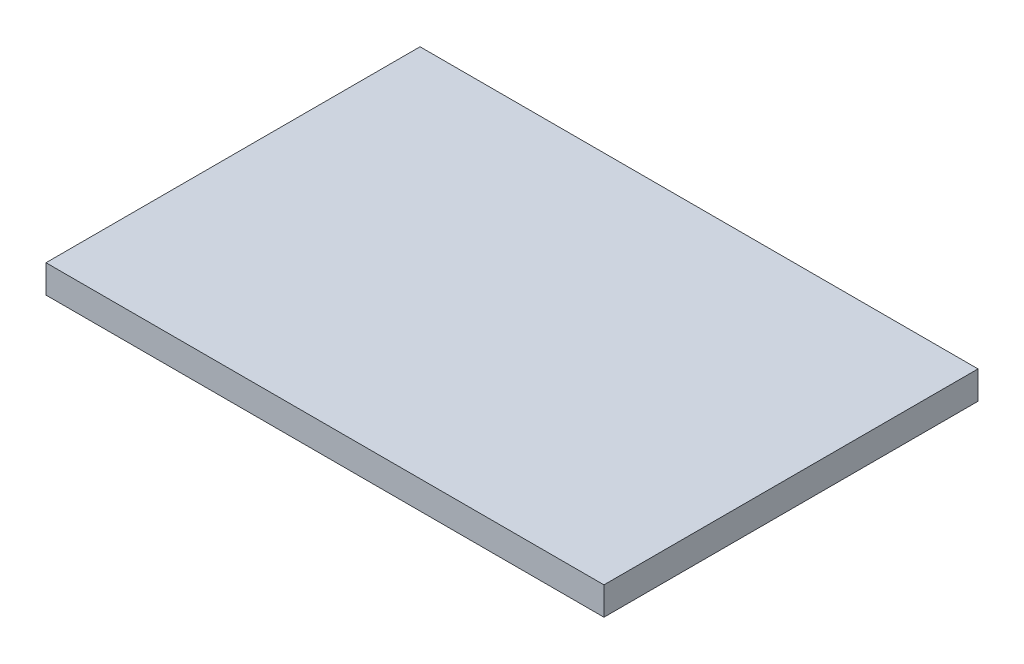
ISO-10303-21;
HEADER;
FILE_DESCRIPTION(('STEP AP214'),'2;1');
FILE_NAME('part.step','',(''),(''),'','','');
FILE_SCHEMA(('AUTOMOTIVE_DESIGN { 1 0 10303 214 1 1 1 1 }'));
ENDSEC;
DATA;
#1=APPLICATION_CONTEXT('core data for automotive mechanical design processes');
#2=APPLICATION_PROTOCOL_DEFINITION('international standard','automotive_design',2000,#1);
#3=PRODUCT_CONTEXT('',#1,'mechanical');
#4=PRODUCT('Part','Part','',(#3));
#5=PRODUCT_RELATED_PRODUCT_CATEGORY('part','',(#4));
#6=PRODUCT_DEFINITION_FORMATION('','',#4);
#7=PRODUCT_DEFINITION_CONTEXT('part definition',#1,'design');
#8=PRODUCT_DEFINITION('design','',#6,#7);
#9=PRODUCT_DEFINITION_SHAPE('','',#8);
#10=(LENGTH_UNIT() NAMED_UNIT(*) SI_UNIT(.MILLI.,.METRE.));
#11=(NAMED_UNIT(*) PLANE_ANGLE_UNIT() SI_UNIT($,.RADIAN.));
#12=(NAMED_UNIT(*) SI_UNIT($,.STERADIAN.) SOLID_ANGLE_UNIT());
#13=UNCERTAINTY_MEASURE_WITH_UNIT(LENGTH_MEASURE(1.E-05),#10,'distance_accuracy_value','');
#14=(GEOMETRIC_REPRESENTATION_CONTEXT(3) GLOBAL_UNCERTAINTY_ASSIGNED_CONTEXT((#13)) GLOBAL_UNIT_ASSIGNED_CONTEXT((#10,
#11,#12)) REPRESENTATION_CONTEXT('',''));
#15=CARTESIAN_POINT('',(0.,0.,0.));
#16=DIRECTION('',(0.,0.,1.));
#17=DIRECTION('',(1.,0.,0.));
#18=AXIS2_PLACEMENT_3D('',#15,#16,#17);
#19=CARTESIAN_POINT('',(179.,18.,-120.));
#20=DIRECTION('',(-1.,0.,0.));
#21=DIRECTION('',(0.,0.,1.));
#22=AXIS2_PLACEMENT_3D('',#19,#20,#21);
#23=PLANE('',#22);
#24=DIRECTION('',(0.,0.,-1.));
#25=VECTOR('',#24,1.);
#26=CARTESIAN_POINT('',(179.,0.,-120.));
#27=LINE('',#26,#25);
#28=CARTESIAN_POINT('',(179.,0.,120.));
#29=VERTEX_POINT('',#28);
#30=CARTESIAN_POINT('',(179.,0.,-120.));
#31=VERTEX_POINT('',#30);
#32=EDGE_CURVE('E96',#29,#31,#27,.T.);
#33=ORIENTED_EDGE('',*,*,#32,.T.);
#34=DIRECTION('',(0.,-1.,0.));
#35=VECTOR('',#34,1.);
#36=CARTESIAN_POINT('',(179.,18.,-120.));
#37=LINE('',#36,#35);
#38=CARTESIAN_POINT('',(179.,18.,-120.));
#39=VERTEX_POINT('',#38);
#40=EDGE_CURVE('E11',#39,#31,#37,.T.);
#41=ORIENTED_EDGE('',*,*,#40,.F.);
#42=DIRECTION('',(0.,0.,-1.));
#43=VECTOR('',#42,1.);
#44=CARTESIAN_POINT('',(179.,18.,-120.));
#45=LINE('',#44,#43);
#46=CARTESIAN_POINT('',(179.,18.,120.));
#47=VERTEX_POINT('',#46);
#48=EDGE_CURVE('E84',#47,#39,#45,.T.);
#49=ORIENTED_EDGE('',*,*,#48,.F.);
#50=DIRECTION('',(0.,-1.,0.));
#51=VECTOR('',#50,1.);
#52=CARTESIAN_POINT('',(179.,18.,120.));
#53=LINE('',#52,#51);
#54=EDGE_CURVE('E92',#47,#29,#53,.T.);
#55=ORIENTED_EDGE('',*,*,#54,.T.);
#56=EDGE_LOOP('',(#33,#41,#49,#55));
#57=FACE_BOUND('',#56,.T.);
#58=ADVANCED_FACE('F33',(#57),#23,.F.);
#59=CARTESIAN_POINT('',(-179.,18.,-120.));
#60=DIRECTION('',(0.,0.,1.));
#61=DIRECTION('',(1.,0.,0.));
#62=AXIS2_PLACEMENT_3D('',#59,#60,#61);
#63=PLANE('',#62);
#64=DIRECTION('',(-1.,0.,0.));
#65=VECTOR('',#64,1.);
#66=CARTESIAN_POINT('',(-179.,0.,-120.));
#67=LINE('',#66,#65);
#68=CARTESIAN_POINT('',(-179.,0.,-120.));
#69=VERTEX_POINT('',#68);
#70=EDGE_CURVE('E88',#31,#69,#67,.T.);
#71=ORIENTED_EDGE('',*,*,#70,.T.);
#72=DIRECTION('',(0.,-1.,0.));
#73=VECTOR('',#72,1.);
#74=CARTESIAN_POINT('',(-179.,18.,-120.));
#75=LINE('',#74,#73);
#76=CARTESIAN_POINT('',(-179.,18.,-120.));
#77=VERTEX_POINT('',#76);
#78=EDGE_CURVE('E41',#77,#69,#75,.T.);
#79=ORIENTED_EDGE('',*,*,#78,.F.);
#80=DIRECTION('',(-1.,0.,0.));
#81=VECTOR('',#80,1.);
#82=CARTESIAN_POINT('',(-179.,18.,-120.));
#83=LINE('',#82,#81);
#84=EDGE_CURVE('E79',#39,#77,#83,.T.);
#85=ORIENTED_EDGE('',*,*,#84,.F.);
#86=ORIENTED_EDGE('',*,*,#40,.T.);
#87=EDGE_LOOP('',(#71,#79,#85,#86));
#88=FACE_BOUND('',#87,.T.);
#89=ADVANCED_FACE('F87',(#88),#63,.F.);
#90=CARTESIAN_POINT('',(-179.,18.,-120.));
#91=DIRECTION('',(1.,0.,0.));
#92=DIRECTION('',(0.,0.,-1.));
#93=AXIS2_PLACEMENT_3D('',#90,#91,#92);
#94=PLANE('',#93);
#95=DIRECTION('',(0.,0.,1.));
#96=VECTOR('',#95,1.);
#97=CARTESIAN_POINT('',(-179.,0.,-120.));
#98=LINE('',#97,#96);
#99=CARTESIAN_POINT('',(-179.,0.,120.));
#100=VERTEX_POINT('',#99);
#101=EDGE_CURVE('E66',#69,#100,#98,.T.);
#102=ORIENTED_EDGE('',*,*,#101,.T.);
#103=DIRECTION('',(0.,-1.,0.));
#104=VECTOR('',#103,1.);
#105=CARTESIAN_POINT('',(-179.,18.,120.));
#106=LINE('',#105,#104);
#107=CARTESIAN_POINT('',(-179.,18.,120.));
#108=VERTEX_POINT('',#107);
#109=EDGE_CURVE('E89',#108,#100,#106,.T.);
#110=ORIENTED_EDGE('',*,*,#109,.F.);
#111=DIRECTION('',(0.,0.,1.));
#112=VECTOR('',#111,1.);
#113=CARTESIAN_POINT('',(-179.,18.,-120.));
#114=LINE('',#113,#112);
#115=EDGE_CURVE('E82',#77,#108,#114,.T.);
#116=ORIENTED_EDGE('',*,*,#115,.F.);
#117=ORIENTED_EDGE('',*,*,#78,.T.);
#118=EDGE_LOOP('',(#102,#110,#116,#117));
#119=FACE_BOUND('',#118,.T.);
#120=ADVANCED_FACE('F90',(#119),#94,.F.);
#121=CARTESIAN_POINT('',(-179.,18.,120.));
#122=DIRECTION('',(0.,0.,-1.));
#123=DIRECTION('',(-1.,0.,0.));
#124=AXIS2_PLACEMENT_3D('',#121,#122,#123);
#125=PLANE('',#124);
#126=DIRECTION('',(1.,0.,0.));
#127=VECTOR('',#126,1.);
#128=CARTESIAN_POINT('',(-179.,0.,120.));
#129=LINE('',#128,#127);
#130=EDGE_CURVE('E72',#100,#29,#129,.T.);
#131=ORIENTED_EDGE('',*,*,#130,.T.);
#132=ORIENTED_EDGE('',*,*,#54,.F.);
#133=DIRECTION('',(1.,0.,0.));
#134=VECTOR('',#133,1.);
#135=CARTESIAN_POINT('',(-179.,18.,120.));
#136=LINE('',#135,#134);
#137=EDGE_CURVE('E49',#108,#47,#136,.T.);
#138=ORIENTED_EDGE('',*,*,#137,.F.);
#139=ORIENTED_EDGE('',*,*,#109,.T.);
#140=EDGE_LOOP('',(#131,#132,#138,#139));
#141=FACE_BOUND('',#140,.T.);
#142=ADVANCED_FACE('F103',(#141),#125,.F.);
#143=CARTESIAN_POINT('',(0.,18.,0.));
#144=DIRECTION('',(0.,1.,0.));
#145=DIRECTION('',(0.,0.,1.));
#146=AXIS2_PLACEMENT_3D('',#143,#144,#145);
#147=PLANE('',#146);
#148=ORIENTED_EDGE('',*,*,#48,.T.);
#149=ORIENTED_EDGE('',*,*,#84,.T.);
#150=ORIENTED_EDGE('',*,*,#115,.T.);
#151=ORIENTED_EDGE('',*,*,#137,.T.);
#152=EDGE_LOOP('',(#148,#149,#150,#151));
#153=FACE_BOUND('',#152,.T.);
#154=ADVANCED_FACE('F80',(#153),#147,.T.);
#155=CARTESIAN_POINT('',(0.,0.,0.));
#156=DIRECTION('',(0.,1.,0.));
#157=DIRECTION('',(0.,0.,1.));
#158=AXIS2_PLACEMENT_3D('',#155,#156,#157);
#159=PLANE('',#158);
#160=ORIENTED_EDGE('',*,*,#32,.F.);
#161=ORIENTED_EDGE('',*,*,#130,.F.);
#162=ORIENTED_EDGE('',*,*,#101,.F.);
#163=ORIENTED_EDGE('',*,*,#70,.F.);
#164=EDGE_LOOP('',(#160,#161,#162,#163));
#165=FACE_BOUND('',#164,.T.);
#166=ADVANCED_FACE('F106',(#165),#159,.F.);
#167=CLOSED_SHELL('',(#58,#89,#120,#142,#154,#166));
#168=MANIFOLD_SOLID_BREP('B2',#167);
#169=ADVANCED_BREP_SHAPE_REPRESENTATION('',(#18,#168),#14);
#170=SHAPE_DEFINITION_REPRESENTATION(#9,#169);
ENDSEC;
END-ISO-10303-21;
